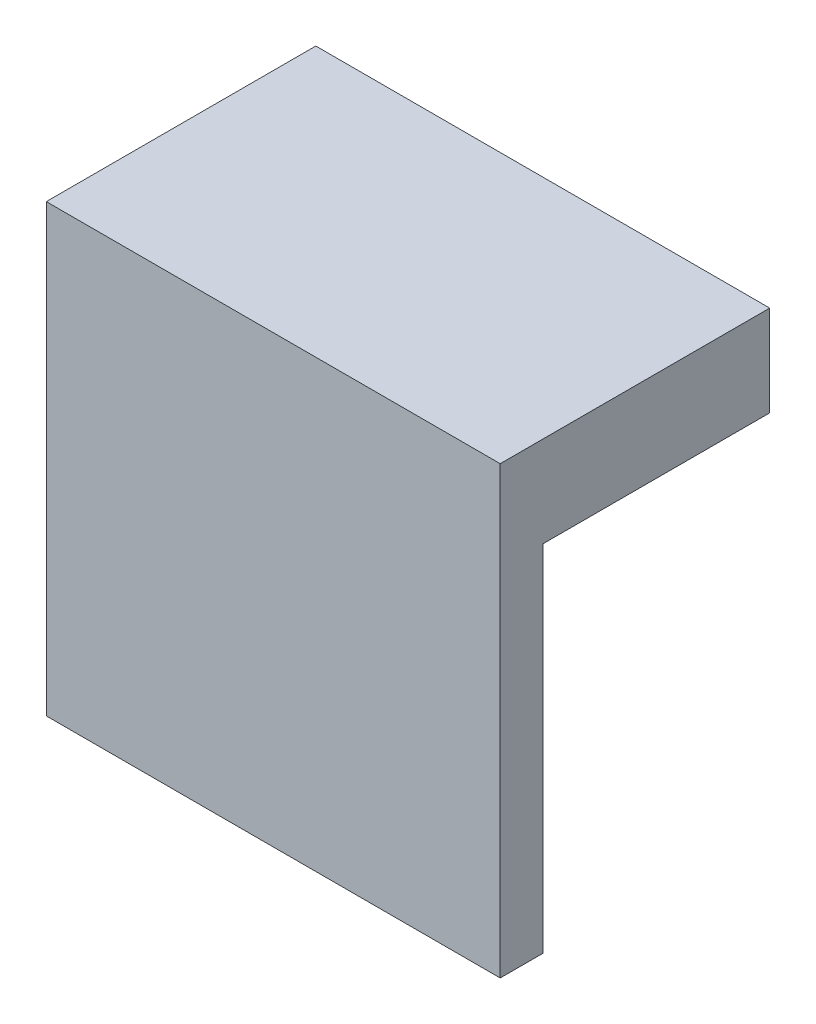
ISO-10303-21;
HEADER;
FILE_DESCRIPTION(('STEP AP214'),'2;1');
FILE_NAME('part.step','',(''),(''),'','','');
FILE_SCHEMA(('AUTOMOTIVE_DESIGN { 1 0 10303 214 1 1 1 1 }'));
ENDSEC;
DATA;
#1=APPLICATION_CONTEXT('core data for automotive mechanical design processes');
#2=APPLICATION_PROTOCOL_DEFINITION('international standard','automotive_design',2000,#1);
#3=PRODUCT_CONTEXT('',#1,'mechanical');
#4=PRODUCT('Part','Part','',(#3));
#5=PRODUCT_RELATED_PRODUCT_CATEGORY('part','',(#4));
#6=PRODUCT_DEFINITION_FORMATION('','',#4);
#7=PRODUCT_DEFINITION_CONTEXT('part definition',#1,'design');
#8=PRODUCT_DEFINITION('design','',#6,#7);
#9=PRODUCT_DEFINITION_SHAPE('','',#8);
#10=(LENGTH_UNIT() NAMED_UNIT(*) SI_UNIT(.MILLI.,.METRE.));
#11=(NAMED_UNIT(*) PLANE_ANGLE_UNIT() SI_UNIT($,.RADIAN.));
#12=(NAMED_UNIT(*) SI_UNIT($,.STERADIAN.) SOLID_ANGLE_UNIT());
#13=UNCERTAINTY_MEASURE_WITH_UNIT(LENGTH_MEASURE(1.E-05),#10,'distance_accuracy_value','');
#14=(GEOMETRIC_REPRESENTATION_CONTEXT(3) GLOBAL_UNCERTAINTY_ASSIGNED_CONTEXT((#13)) GLOBAL_UNIT_ASSIGNED_CONTEXT((#10,
#11,#12)) REPRESENTATION_CONTEXT('',''));
#15=CARTESIAN_POINT('',(0.,0.,0.));
#16=DIRECTION('',(0.,0.,1.));
#17=DIRECTION('',(1.,0.,0.));
#18=AXIS2_PLACEMENT_3D('',#15,#16,#17);
#19=CARTESIAN_POINT('',(0.,0.,0.));
#20=DIRECTION('',(0.,-1.,0.));
#21=DIRECTION('',(0.,0.,-1.));
#22=AXIS2_PLACEMENT_3D('',#19,#20,#21);
#23=PLANE('',#22);
#24=DIRECTION('',(0.,0.,-1.));
#25=VECTOR('',#24,1.);
#26=CARTESIAN_POINT('',(8.,0.,4.75));
#27=LINE('',#26,#25);
#28=CARTESIAN_POINT('',(8.,0.,3.25));
#29=VERTEX_POINT('',#28);
#30=CARTESIAN_POINT('',(8.,0.,-4.75));
#31=VERTEX_POINT('',#30);
#32=EDGE_CURVE('E126',#29,#31,#27,.T.);
#33=ORIENTED_EDGE('',*,*,#32,.F.);
#34=DIRECTION('',(-1.,0.,0.));
#35=VECTOR('',#34,1.);
#36=CARTESIAN_POINT('',(-8.,0.,3.25));
#37=LINE('',#36,#35);
#38=CARTESIAN_POINT('',(-8.,0.,3.25));
#39=VERTEX_POINT('',#38);
#40=EDGE_CURVE('E111',#29,#39,#37,.T.);
#41=ORIENTED_EDGE('',*,*,#40,.T.);
#42=DIRECTION('',(0.,0.,1.));
#43=VECTOR('',#42,1.);
#44=CARTESIAN_POINT('',(-8.,0.,4.75));
#45=LINE('',#44,#43);
#46=CARTESIAN_POINT('',(-8.,0.,-4.75));
#47=VERTEX_POINT('',#46);
#48=EDGE_CURVE('E120',#47,#39,#45,.T.);
#49=ORIENTED_EDGE('',*,*,#48,.F.);
#50=DIRECTION('',(-1.,0.,0.));
#51=VECTOR('',#50,1.);
#52=CARTESIAN_POINT('',(-8.,0.,-4.75));
#53=LINE('',#52,#51);
#54=EDGE_CURVE('E78',#31,#47,#53,.T.);
#55=ORIENTED_EDGE('',*,*,#54,.F.);
#56=EDGE_LOOP('',(#33,#41,#49,#55));
#57=FACE_BOUND('',#56,.T.);
#58=ADVANCED_FACE('F39',(#57),#23,.T.);
#59=CARTESIAN_POINT('',(8.,3.2,4.75));
#60=DIRECTION('',(-1.,0.,0.));
#61=DIRECTION('',(0.,0.,1.));
#62=AXIS2_PLACEMENT_3D('',#59,#60,#61);
#63=PLANE('',#62);
#64=DIRECTION('',(0.,-1.,0.));
#65=VECTOR('',#64,1.);
#66=CARTESIAN_POINT('',(8.,3.2,4.75));
#67=LINE('',#66,#65);
#68=CARTESIAN_POINT('',(8.,3.2,4.75));
#69=VERTEX_POINT('',#68);
#70=CARTESIAN_POINT('',(8.,-12.5,4.75));
#71=VERTEX_POINT('',#70);
#72=EDGE_CURVE('E134',#69,#71,#67,.T.);
#73=ORIENTED_EDGE('',*,*,#72,.T.);
#74=DIRECTION('',(0.,0.,1.));
#75=VECTOR('',#74,1.);
#76=CARTESIAN_POINT('',(8.,-12.5,3.25));
#77=LINE('',#76,#75);
#78=CARTESIAN_POINT('',(8.,-12.5,3.25));
#79=VERTEX_POINT('',#78);
#80=EDGE_CURVE('E110',#79,#71,#77,.T.);
#81=ORIENTED_EDGE('',*,*,#80,.F.);
#82=DIRECTION('',(0.,1.,0.));
#83=VECTOR('',#82,1.);
#84=CARTESIAN_POINT('',(8.,0.,3.25));
#85=LINE('',#84,#83);
#86=EDGE_CURVE('E115',#79,#29,#85,.T.);
#87=ORIENTED_EDGE('',*,*,#86,.T.);
#88=ORIENTED_EDGE('',*,*,#32,.T.);
#89=DIRECTION('',(0.,-1.,0.));
#90=VECTOR('',#89,1.);
#91=CARTESIAN_POINT('',(8.,3.2,-4.75));
#92=LINE('',#91,#90);
#93=CARTESIAN_POINT('',(8.,3.2,-4.75));
#94=VERTEX_POINT('',#93);
#95=EDGE_CURVE('E11',#94,#31,#92,.T.);
#96=ORIENTED_EDGE('',*,*,#95,.F.);
#97=DIRECTION('',(0.,0.,-1.));
#98=VECTOR('',#97,1.);
#99=CARTESIAN_POINT('',(8.,3.2,4.75));
#100=LINE('',#99,#98);
#101=EDGE_CURVE('E128',#69,#94,#100,.T.);
#102=ORIENTED_EDGE('',*,*,#101,.F.);
#103=EDGE_LOOP('',(#73,#81,#87,#88,#96,#102));
#104=FACE_BOUND('',#103,.T.);
#105=ADVANCED_FACE('F41',(#104),#63,.F.);
#106=CARTESIAN_POINT('',(-8.,3.2,-4.75));
#107=DIRECTION('',(0.,0.,1.));
#108=DIRECTION('',(1.,0.,0.));
#109=AXIS2_PLACEMENT_3D('',#106,#107,#108);
#110=PLANE('',#109);
#111=ORIENTED_EDGE('',*,*,#54,.T.);
#112=DIRECTION('',(0.,-1.,0.));
#113=VECTOR('',#112,1.);
#114=CARTESIAN_POINT('',(-8.,3.2,-4.75));
#115=LINE('',#114,#113);
#116=CARTESIAN_POINT('',(-8.,3.2,-4.75));
#117=VERTEX_POINT('',#116);
#118=EDGE_CURVE('E47',#117,#47,#115,.T.);
#119=ORIENTED_EDGE('',*,*,#118,.F.);
#120=DIRECTION('',(-1.,0.,0.));
#121=VECTOR('',#120,1.);
#122=CARTESIAN_POINT('',(-8.,3.2,-4.75));
#123=LINE('',#122,#121);
#124=EDGE_CURVE('E83',#94,#117,#123,.T.);
#125=ORIENTED_EDGE('',*,*,#124,.F.);
#126=ORIENTED_EDGE('',*,*,#95,.T.);
#127=EDGE_LOOP('',(#111,#119,#125,#126));
#128=FACE_BOUND('',#127,.T.);
#129=ADVANCED_FACE('F163',(#128),#110,.F.);
#130=CARTESIAN_POINT('',(-8.,3.2,4.75));
#131=DIRECTION('',(1.,0.,0.));
#132=DIRECTION('',(0.,0.,-1.));
#133=AXIS2_PLACEMENT_3D('',#130,#131,#132);
#134=PLANE('',#133);
#135=ORIENTED_EDGE('',*,*,#48,.T.);
#136=DIRECTION('',(0.,-1.,0.));
#137=VECTOR('',#136,1.);
#138=CARTESIAN_POINT('',(-8.,0.,3.25));
#139=LINE('',#138,#137);
#140=CARTESIAN_POINT('',(-8.,-12.5,3.25));
#141=VERTEX_POINT('',#140);
#142=EDGE_CURVE('E54',#39,#141,#139,.T.);
#143=ORIENTED_EDGE('',*,*,#142,.T.);
#144=DIRECTION('',(0.,0.,1.));
#145=VECTOR('',#144,1.);
#146=CARTESIAN_POINT('',(-8.,-12.5,3.25));
#147=LINE('',#146,#145);
#148=CARTESIAN_POINT('',(-8.,-12.5,4.75));
#149=VERTEX_POINT('',#148);
#150=EDGE_CURVE('E102',#141,#149,#147,.T.);
#151=ORIENTED_EDGE('',*,*,#150,.T.);
#152=DIRECTION('',(0.,-1.,0.));
#153=VECTOR('',#152,1.);
#154=CARTESIAN_POINT('',(-8.,3.2,4.75));
#155=LINE('',#154,#153);
#156=CARTESIAN_POINT('',(-8.,3.2,4.75));
#157=VERTEX_POINT('',#156);
#158=EDGE_CURVE('E139',#157,#149,#155,.T.);
#159=ORIENTED_EDGE('',*,*,#158,.F.);
#160=DIRECTION('',(0.,0.,1.));
#161=VECTOR('',#160,1.);
#162=CARTESIAN_POINT('',(-8.,3.2,4.75));
#163=LINE('',#162,#161);
#164=EDGE_CURVE('E131',#117,#157,#163,.T.);
#165=ORIENTED_EDGE('',*,*,#164,.F.);
#166=ORIENTED_EDGE('',*,*,#118,.T.);
#167=EDGE_LOOP('',(#135,#143,#151,#159,#165,#166));
#168=FACE_BOUND('',#167,.T.);
#169=ADVANCED_FACE('F118',(#168),#134,.F.);
#170=CARTESIAN_POINT('',(-8.,3.2,4.75));
#171=DIRECTION('',(0.,0.,-1.));
#172=DIRECTION('',(-1.,0.,0.));
#173=AXIS2_PLACEMENT_3D('',#170,#171,#172);
#174=PLANE('',#173);
#175=ORIENTED_EDGE('',*,*,#158,.T.);
#176=DIRECTION('',(1.,0.,0.));
#177=VECTOR('',#176,1.);
#178=CARTESIAN_POINT('',(-8.,-12.5,4.75));
#179=LINE('',#178,#177);
#180=EDGE_CURVE('E107',#149,#71,#179,.T.);
#181=ORIENTED_EDGE('',*,*,#180,.T.);
#182=ORIENTED_EDGE('',*,*,#72,.F.);
#183=DIRECTION('',(1.,0.,0.));
#184=VECTOR('',#183,1.);
#185=CARTESIAN_POINT('',(-8.,3.2,4.75));
#186=LINE('',#185,#184);
#187=EDGE_CURVE('E63',#157,#69,#186,.T.);
#188=ORIENTED_EDGE('',*,*,#187,.F.);
#189=EDGE_LOOP('',(#175,#181,#182,#188));
#190=FACE_BOUND('',#189,.T.);
#191=ADVANCED_FACE('F147',(#190),#174,.F.);
#192=CARTESIAN_POINT('',(0.,3.2,0.));
#193=DIRECTION('',(0.,-1.,0.));
#194=DIRECTION('',(0.,0.,-1.));
#195=AXIS2_PLACEMENT_3D('',#192,#193,#194);
#196=PLANE('',#195);
#197=ORIENTED_EDGE('',*,*,#101,.T.);
#198=ORIENTED_EDGE('',*,*,#124,.T.);
#199=ORIENTED_EDGE('',*,*,#164,.T.);
#200=ORIENTED_EDGE('',*,*,#187,.T.);
#201=EDGE_LOOP('',(#197,#198,#199,#200));
#202=FACE_BOUND('',#201,.T.);
#203=ADVANCED_FACE('F148',(#202),#196,.F.);
#204=CARTESIAN_POINT('',(-8.,-12.5,3.25));
#205=DIRECTION('',(0.,-1.,0.));
#206=DIRECTION('',(0.,0.,-1.));
#207=AXIS2_PLACEMENT_3D('',#204,#205,#206);
#208=PLANE('',#207);
#209=ORIENTED_EDGE('',*,*,#180,.F.);
#210=ORIENTED_EDGE('',*,*,#150,.F.);
#211=DIRECTION('',(1.,0.,0.));
#212=VECTOR('',#211,1.);
#213=CARTESIAN_POINT('',(-8.,-12.5,3.25));
#214=LINE('',#213,#212);
#215=EDGE_CURVE('E105',#141,#79,#214,.T.);
#216=ORIENTED_EDGE('',*,*,#215,.T.);
#217=ORIENTED_EDGE('',*,*,#80,.T.);
#218=EDGE_LOOP('',(#209,#210,#216,#217));
#219=FACE_BOUND('',#218,.T.);
#220=ADVANCED_FACE('F103',(#219),#208,.T.);
#221=CARTESIAN_POINT('',(0.,0.,3.25));
#222=DIRECTION('',(0.,0.,1.));
#223=DIRECTION('',(1.,0.,0.));
#224=AXIS2_PLACEMENT_3D('',#221,#222,#223);
#225=PLANE('',#224);
#226=ORIENTED_EDGE('',*,*,#142,.F.);
#227=ORIENTED_EDGE('',*,*,#40,.F.);
#228=ORIENTED_EDGE('',*,*,#86,.F.);
#229=ORIENTED_EDGE('',*,*,#215,.F.);
#230=EDGE_LOOP('',(#226,#227,#228,#229));
#231=FACE_BOUND('',#230,.T.);
#232=ADVANCED_FACE('F114',(#231),#225,.F.);
#233=CLOSED_SHELL('',(#58,#105,#129,#169,#191,#203,#220,#232));
#234=MANIFOLD_SOLID_BREP('B2',#233);
#235=ADVANCED_BREP_SHAPE_REPRESENTATION('',(#18,#234),#14);
#236=SHAPE_DEFINITION_REPRESENTATION(#9,#235);
ENDSEC;
END-ISO-10303-21;
